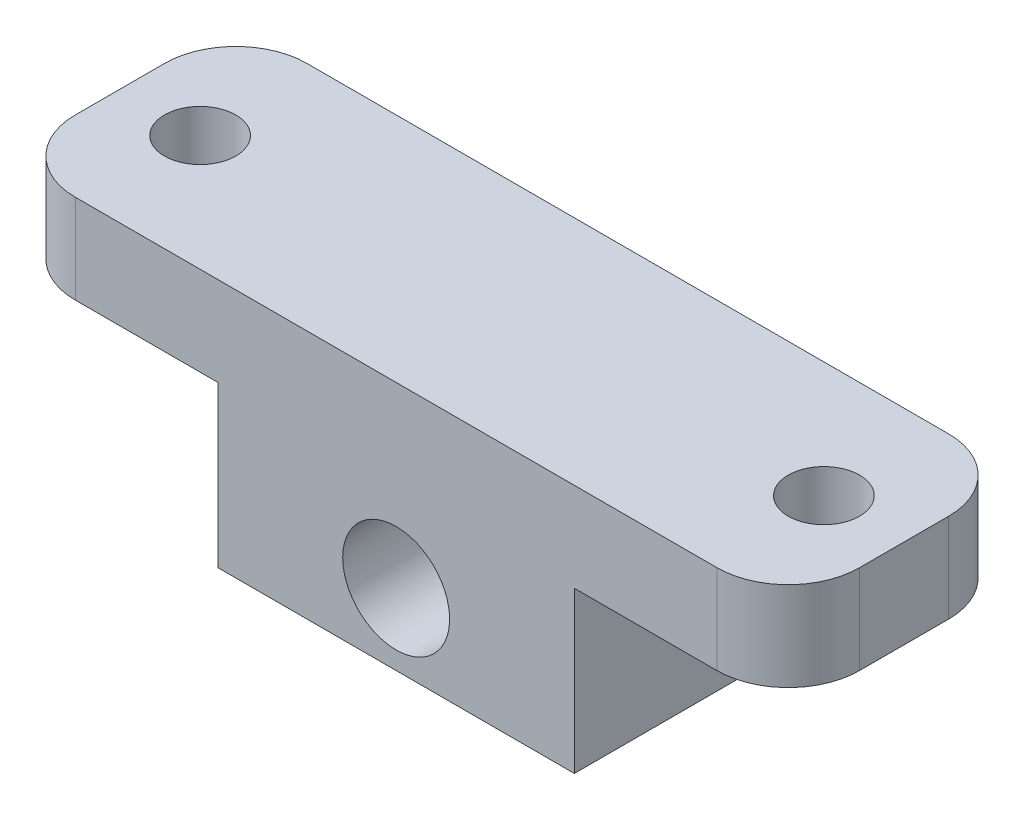
ISO-10303-21;
HEADER;
FILE_DESCRIPTION(('STEP AP214'),'2;1');
FILE_NAME('part.step','',(''),(''),'','','');
FILE_SCHEMA(('AUTOMOTIVE_DESIGN { 1 0 10303 214 1 1 1 1 }'));
ENDSEC;
DATA;
#1=APPLICATION_CONTEXT('core data for automotive mechanical design processes');
#2=APPLICATION_PROTOCOL_DEFINITION('international standard','automotive_design',2000,#1);
#3=PRODUCT_CONTEXT('',#1,'mechanical');
#4=PRODUCT('Part','Part','',(#3));
#5=PRODUCT_RELATED_PRODUCT_CATEGORY('part','',(#4));
#6=PRODUCT_DEFINITION_FORMATION('','',#4);
#7=PRODUCT_DEFINITION_CONTEXT('part definition',#1,'design');
#8=PRODUCT_DEFINITION('design','',#6,#7);
#9=PRODUCT_DEFINITION_SHAPE('','',#8);
#10=(LENGTH_UNIT() NAMED_UNIT(*) SI_UNIT(.MILLI.,.METRE.));
#11=(NAMED_UNIT(*) PLANE_ANGLE_UNIT() SI_UNIT($,.RADIAN.));
#12=(NAMED_UNIT(*) SI_UNIT($,.STERADIAN.) SOLID_ANGLE_UNIT());
#13=UNCERTAINTY_MEASURE_WITH_UNIT(LENGTH_MEASURE(1.E-05),#10,'distance_accuracy_value','');
#14=(GEOMETRIC_REPRESENTATION_CONTEXT(3) GLOBAL_UNCERTAINTY_ASSIGNED_CONTEXT((#13)) GLOBAL_UNIT_ASSIGNED_CONTEXT((#10,
#11,#12)) REPRESENTATION_CONTEXT('',''));
#15=CARTESIAN_POINT('',(0.,0.,0.));
#16=DIRECTION('',(0.,0.,1.));
#17=DIRECTION('',(1.,0.,0.));
#18=AXIS2_PLACEMENT_3D('',#15,#16,#17);
#19=CARTESIAN_POINT('',(5.00000000000001,0.,6.5));
#20=DIRECTION('',(1.,0.,0.));
#21=DIRECTION('',(0.,0.,-1.));
#22=AXIS2_PLACEMENT_3D('',#19,#20,#21);
#23=PLANE('',#22);
#24=DIRECTION('',(0.,0.,-1.));
#25=VECTOR('',#24,1.);
#26=CARTESIAN_POINT('',(5.00000000000001,21.3633860115138,6.5));
#27=LINE('',#26,#25);
#28=CARTESIAN_POINT('',(5.00000000000001,21.3633860115138,6.5));
#29=VERTEX_POINT('',#28);
#30=CARTESIAN_POINT('',(5.,21.3633860115138,0.));
#31=VERTEX_POINT('',#30);
#32=EDGE_CURVE('E139',#29,#31,#27,.T.);
#33=ORIENTED_EDGE('',*,*,#32,.F.);
#34=DIRECTION('',(0.,-1.,0.));
#35=VECTOR('',#34,1.);
#36=CARTESIAN_POINT('',(5.00000000000001,0.,6.5));
#37=LINE('',#36,#35);
#38=CARTESIAN_POINT('',(5.,16.8633860115138,6.5));
#39=VERTEX_POINT('',#38);
#40=EDGE_CURVE('E152',#29,#39,#37,.T.);
#41=ORIENTED_EDGE('',*,*,#40,.T.);
#42=DIRECTION('',(0.,0.,-1.));
#43=VECTOR('',#42,1.);
#44=CARTESIAN_POINT('',(5.,16.8633860115138,6.5));
#45=LINE('',#44,#43);
#46=CARTESIAN_POINT('',(5.,16.8633860115138,0.));
#47=VERTEX_POINT('',#46);
#48=EDGE_CURVE('E186',#39,#47,#45,.T.);
#49=ORIENTED_EDGE('',*,*,#48,.T.);
#50=DIRECTION('',(0.,-1.,0.));
#51=VECTOR('',#50,1.);
#52=CARTESIAN_POINT('',(5.00000000000001,0.,0.));
#53=LINE('',#52,#51);
#54=EDGE_CURVE('E154',#31,#47,#53,.T.);
#55=ORIENTED_EDGE('',*,*,#54,.F.);
#56=EDGE_LOOP('',(#33,#41,#49,#55));
#57=FACE_BOUND('',#56,.T.);
#58=ADVANCED_FACE('F47',(#57),#23,.T.);
#59=CARTESIAN_POINT('',(0.,23.8633860115138,6.5));
#60=DIRECTION('',(0.,1.,0.));
#61=DIRECTION('',(0.,0.,1.));
#62=AXIS2_PLACEMENT_3D('',#59,#60,#61);
#63=PLANE('',#62);
#64=DIRECTION('',(1.,0.,0.));
#65=VECTOR('',#64,1.);
#66=CARTESIAN_POINT('',(0.,23.8633860115138,0.));
#67=LINE('',#66,#65);
#68=CARTESIAN_POINT('',(-9.,23.8633860115138,0.));
#69=VERTEX_POINT('',#68);
#70=CARTESIAN_POINT('',(9.,23.8633860115138,0.));
#71=VERTEX_POINT('',#70);
#72=EDGE_CURVE('E189',#69,#71,#67,.T.);
#73=ORIENTED_EDGE('',*,*,#72,.F.);
#74=CARTESIAN_POINT('',(-9.,23.8633860115138,2.));
#75=DIRECTION('',(0.,1.,0.));
#76=DIRECTION('',(0.,0.,1.));
#77=AXIS2_PLACEMENT_3D('',#74,#75,#76);
#78=CIRCLE('',#77,2.);
#79=CARTESIAN_POINT('',(-11.,23.8633860115138,2.));
#80=VERTEX_POINT('',#79);
#81=EDGE_CURVE('E221',#69,#80,#78,.T.);
#82=ORIENTED_EDGE('',*,*,#81,.T.);
#83=DIRECTION('',(0.,0.,1.));
#84=VECTOR('',#83,1.);
#85=CARTESIAN_POINT('',(-11.,23.8633860115138,6.5));
#86=LINE('',#85,#84);
#87=CARTESIAN_POINT('',(-11.,23.8633860115138,4.5));
#88=VERTEX_POINT('',#87);
#89=EDGE_CURVE('E260',#80,#88,#86,.T.);
#90=ORIENTED_EDGE('',*,*,#89,.T.);
#91=CARTESIAN_POINT('',(-9.,23.8633860115138,4.5));
#92=DIRECTION('',(0.,1.,0.));
#93=DIRECTION('',(0.,0.,1.));
#94=AXIS2_PLACEMENT_3D('',#91,#92,#93);
#95=CIRCLE('',#94,2.);
#96=CARTESIAN_POINT('',(-9.,23.8633860115138,6.5));
#97=VERTEX_POINT('',#96);
#98=EDGE_CURVE('E218',#88,#97,#95,.T.);
#99=ORIENTED_EDGE('',*,*,#98,.T.);
#100=DIRECTION('',(1.,0.,0.));
#101=VECTOR('',#100,1.);
#102=CARTESIAN_POINT('',(0.,23.8633860115138,6.5));
#103=LINE('',#102,#101);
#104=CARTESIAN_POINT('',(9.,23.8633860115138,6.5));
#105=VERTEX_POINT('',#104);
#106=EDGE_CURVE('E165',#97,#105,#103,.T.);
#107=ORIENTED_EDGE('',*,*,#106,.T.);
#108=CARTESIAN_POINT('',(9.,23.8633860115138,4.5));
#109=DIRECTION('',(0.,1.,0.));
#110=DIRECTION('',(0.,0.,1.));
#111=AXIS2_PLACEMENT_3D('',#108,#109,#110);
#112=CIRCLE('',#111,2.);
#113=CARTESIAN_POINT('',(11.,23.8633860115138,4.5));
#114=VERTEX_POINT('',#113);
#115=EDGE_CURVE('E215',#105,#114,#112,.T.);
#116=ORIENTED_EDGE('',*,*,#115,.T.);
#117=DIRECTION('',(0.,0.,-1.));
#118=VECTOR('',#117,1.);
#119=CARTESIAN_POINT('',(11.,23.8633860115138,6.5));
#120=LINE('',#119,#118);
#121=CARTESIAN_POINT('',(11.,23.8633860115138,2.));
#122=VERTEX_POINT('',#121);
#123=EDGE_CURVE('E252',#114,#122,#120,.T.);
#124=ORIENTED_EDGE('',*,*,#123,.T.);
#125=CARTESIAN_POINT('',(9.,23.8633860115138,2.));
#126=DIRECTION('',(0.,1.,0.));
#127=DIRECTION('',(0.,0.,1.));
#128=AXIS2_PLACEMENT_3D('',#125,#126,#127);
#129=CIRCLE('',#128,2.);
#130=EDGE_CURVE('E212',#122,#71,#129,.T.);
#131=ORIENTED_EDGE('',*,*,#130,.T.);
#132=EDGE_LOOP('',(#73,#82,#90,#99,#107,#116,#124,#131));
#133=FACE_BOUND('',#132,.T.);
#134=CARTESIAN_POINT('',(-8.75,23.8633860115138,3.25));
#135=DIRECTION('',(0.,1.,0.));
#136=DIRECTION('',(0.,0.,1.));
#137=AXIS2_PLACEMENT_3D('',#134,#135,#136);
#138=CIRCLE('',#137,1.);
#139=CARTESIAN_POINT('',(-8.75,23.8633860115138,4.25));
#140=VERTEX_POINT('',#139);
#141=EDGE_CURVE('E268',#140,#140,#138,.T.);
#142=ORIENTED_EDGE('',*,*,#141,.F.);
#143=EDGE_LOOP('',(#142));
#144=FACE_BOUND('',#143,.T.);
#145=CARTESIAN_POINT('',(8.75,23.8633860115138,3.25));
#146=DIRECTION('',(0.,1.,0.));
#147=DIRECTION('',(0.,0.,-1.));
#148=AXIS2_PLACEMENT_3D('',#145,#146,#147);
#149=CIRCLE('',#148,1.);
#150=CARTESIAN_POINT('',(8.75,23.8633860115138,2.25));
#151=VERTEX_POINT('',#150);
#152=EDGE_CURVE('E374',#151,#151,#149,.T.);
#153=ORIENTED_EDGE('',*,*,#152,.F.);
#154=EDGE_LOOP('',(#153));
#155=FACE_BOUND('',#154,.T.);
#156=ADVANCED_FACE('F257',(#133,#144,#155),#63,.T.);
#157=CARTESIAN_POINT('',(-4.99999999999999,0.,6.5));
#158=DIRECTION('',(1.,0.,0.));
#159=DIRECTION('',(0.,0.,-1.));
#160=AXIS2_PLACEMENT_3D('',#157,#158,#159);
#161=PLANE('',#160);
#162=DIRECTION('',(0.,-1.,0.));
#163=VECTOR('',#162,1.);
#164=CARTESIAN_POINT('',(-4.99999999999999,0.,6.5));
#165=LINE('',#164,#163);
#166=CARTESIAN_POINT('',(-4.99999999999999,21.3633860115138,6.5));
#167=VERTEX_POINT('',#166);
#168=CARTESIAN_POINT('',(-5.,16.8633860115138,6.5));
#169=VERTEX_POINT('',#168);
#170=EDGE_CURVE('E171',#167,#169,#165,.T.);
#171=ORIENTED_EDGE('',*,*,#170,.F.);
#172=DIRECTION('',(0.,0.,-1.));
#173=VECTOR('',#172,1.);
#174=CARTESIAN_POINT('',(-4.99999999999999,21.3633860115138,6.5));
#175=LINE('',#174,#173);
#176=CARTESIAN_POINT('',(-4.99999999999999,21.3633860115138,0.));
#177=VERTEX_POINT('',#176);
#178=EDGE_CURVE('E156',#167,#177,#175,.T.);
#179=ORIENTED_EDGE('',*,*,#178,.T.);
#180=DIRECTION('',(0.,-1.,0.));
#181=VECTOR('',#180,1.);
#182=CARTESIAN_POINT('',(-4.99999999999999,0.,0.));
#183=LINE('',#182,#181);
#184=CARTESIAN_POINT('',(-5.,16.8633860115138,0.));
#185=VERTEX_POINT('',#184);
#186=EDGE_CURVE('E193',#177,#185,#183,.T.);
#187=ORIENTED_EDGE('',*,*,#186,.T.);
#188=DIRECTION('',(0.,0.,-1.));
#189=VECTOR('',#188,1.);
#190=CARTESIAN_POINT('',(-5.,16.8633860115138,6.5));
#191=LINE('',#190,#189);
#192=EDGE_CURVE('E201',#169,#185,#191,.T.);
#193=ORIENTED_EDGE('',*,*,#192,.F.);
#194=EDGE_LOOP('',(#171,#179,#187,#193));
#195=FACE_BOUND('',#194,.T.);
#196=ADVANCED_FACE('F282',(#195),#161,.F.);
#197=CARTESIAN_POINT('',(0.,16.8633860115138,6.5));
#198=DIRECTION('',(0.,1.,0.));
#199=DIRECTION('',(0.,0.,1.));
#200=AXIS2_PLACEMENT_3D('',#197,#198,#199);
#201=PLANE('',#200);
#202=DIRECTION('',(1.,0.,0.));
#203=VECTOR('',#202,1.);
#204=CARTESIAN_POINT('',(0.,16.8633860115138,0.));
#205=LINE('',#204,#203);
#206=EDGE_CURVE('E174',#185,#47,#205,.T.);
#207=ORIENTED_EDGE('',*,*,#206,.T.);
#208=ORIENTED_EDGE('',*,*,#48,.F.);
#209=DIRECTION('',(1.,0.,0.));
#210=VECTOR('',#209,1.);
#211=CARTESIAN_POINT('',(0.,16.8633860115138,6.5));
#212=LINE('',#211,#210);
#213=EDGE_CURVE('E162',#169,#39,#212,.T.);
#214=ORIENTED_EDGE('',*,*,#213,.F.);
#215=ORIENTED_EDGE('',*,*,#192,.T.);
#216=EDGE_LOOP('',(#207,#208,#214,#215));
#217=FACE_BOUND('',#216,.T.);
#218=ADVANCED_FACE('F340',(#217),#201,.F.);
#219=CARTESIAN_POINT('',(0.,18.8633860115138,6.5));
#220=DIRECTION('',(0.,0.,-1.));
#221=DIRECTION('',(-1.,0.,0.));
#222=AXIS2_PLACEMENT_3D('',#219,#220,#221);
#223=CYLINDRICAL_SURFACE('',#222,1.5);
#224=CARTESIAN_POINT('',(0.,18.8633860115138,6.5));
#225=DIRECTION('',(0.,0.,1.));
#226=DIRECTION('',(1.,0.,0.));
#227=AXIS2_PLACEMENT_3D('',#224,#225,#226);
#228=CIRCLE('',#227,1.5);
#229=CARTESIAN_POINT('',(-1.5,18.8633860115138,6.5));
#230=VERTEX_POINT('',#229);
#231=EDGE_CURVE('E182',#230,#230,#228,.T.);
#232=CARTESIAN_POINT('',(0.,18.8633860115138,0.));
#233=DIRECTION('',(0.,0.,1.));
#234=DIRECTION('',(1.,0.,0.));
#235=AXIS2_PLACEMENT_3D('',#232,#233,#234);
#236=CIRCLE('',#235,1.5);
#237=CARTESIAN_POINT('',(-1.5,18.8633860115138,0.));
#238=VERTEX_POINT('',#237);
#239=EDGE_CURVE('E166',#238,#238,#236,.T.);
#240=CARTESIAN_POINT('',(-1.5,18.8633860115138,6.5));
#241=CARTESIAN_POINT('',(-1.5,18.8633860115138,6.43229166666667));
#242=CARTESIAN_POINT('',(-1.5,18.8633860115138,6.36458333333333));
#243=CARTESIAN_POINT('',(-1.5,18.8633860115138,6.22916666666667));
#244=CARTESIAN_POINT('',(-1.5,18.8633860115138,6.16145833333333));
#245=CARTESIAN_POINT('',(-1.5,18.8633860115138,6.02604166666667));
#246=CARTESIAN_POINT('',(-1.5,18.8633860115138,5.95833333333333));
#247=CARTESIAN_POINT('',(-1.5,18.8633860115138,5.82291666666667));
#248=CARTESIAN_POINT('',(-1.5,18.8633860115138,5.75520833333333));
#249=CARTESIAN_POINT('',(-1.5,18.8633860115138,5.61979166666667));
#250=CARTESIAN_POINT('',(-1.5,18.8633860115138,5.55208333333333));
#251=CARTESIAN_POINT('',(-1.5,18.8633860115138,5.41666666666667));
#252=CARTESIAN_POINT('',(-1.5,18.8633860115138,5.34895833333333));
#253=CARTESIAN_POINT('',(-1.5,18.8633860115138,5.21354166666667));
#254=CARTESIAN_POINT('',(-1.5,18.8633860115138,5.14583333333333));
#255=CARTESIAN_POINT('',(-1.5,18.8633860115138,5.01041666666667));
#256=CARTESIAN_POINT('',(-1.5,18.8633860115138,4.94270833333333));
#257=CARTESIAN_POINT('',(-1.5,18.8633860115138,4.80729166666667));
#258=CARTESIAN_POINT('',(-1.5,18.8633860115138,4.73958333333333));
#259=CARTESIAN_POINT('',(-1.5,18.8633860115138,4.60416666666667));
#260=CARTESIAN_POINT('',(-1.5,18.8633860115138,4.53645833333333));
#261=CARTESIAN_POINT('',(-1.5,18.8633860115138,4.40104166666667));
#262=CARTESIAN_POINT('',(-1.5,18.8633860115138,4.33333333333333));
#263=CARTESIAN_POINT('',(-1.5,18.8633860115138,4.19791666666667));
#264=CARTESIAN_POINT('',(-1.5,18.8633860115138,4.13020833333333));
#265=CARTESIAN_POINT('',(-1.5,18.8633860115138,3.99479166666667));
#266=CARTESIAN_POINT('',(-1.5,18.8633860115138,3.92708333333333));
#267=CARTESIAN_POINT('',(-1.5,18.8633860115138,3.79166666666667));
#268=CARTESIAN_POINT('',(-1.5,18.8633860115138,3.72395833333333));
#269=CARTESIAN_POINT('',(-1.5,18.8633860115138,3.58854166666667));
#270=CARTESIAN_POINT('',(-1.5,18.8633860115138,3.52083333333333));
#271=CARTESIAN_POINT('',(-1.5,18.8633860115138,3.38541666666667));
#272=CARTESIAN_POINT('',(-1.5,18.8633860115138,3.31770833333333));
#273=CARTESIAN_POINT('',(-1.5,18.8633860115138,3.18229166666667));
#274=CARTESIAN_POINT('',(-1.5,18.8633860115138,3.11458333333333));
#275=CARTESIAN_POINT('',(-1.5,18.8633860115138,2.97916666666667));
#276=CARTESIAN_POINT('',(-1.5,18.8633860115138,2.91145833333333));
#277=CARTESIAN_POINT('',(-1.5,18.8633860115138,2.77604166666667));
#278=CARTESIAN_POINT('',(-1.5,18.8633860115138,2.70833333333333));
#279=CARTESIAN_POINT('',(-1.5,18.8633860115138,2.57291666666667));
#280=CARTESIAN_POINT('',(-1.5,18.8633860115138,2.50520833333333));
#281=CARTESIAN_POINT('',(-1.5,18.8633860115138,2.36979166666667));
#282=CARTESIAN_POINT('',(-1.5,18.8633860115138,2.30208333333333));
#283=CARTESIAN_POINT('',(-1.5,18.8633860115138,2.16666666666667));
#284=CARTESIAN_POINT('',(-1.5,18.8633860115138,2.09895833333333));
#285=CARTESIAN_POINT('',(-1.5,18.8633860115138,1.96354166666667));
#286=CARTESIAN_POINT('',(-1.5,18.8633860115138,1.89583333333333));
#287=CARTESIAN_POINT('',(-1.5,18.8633860115138,1.76041666666667));
#288=CARTESIAN_POINT('',(-1.5,18.8633860115138,1.69270833333333));
#289=CARTESIAN_POINT('',(-1.5,18.8633860115138,1.55729166666667));
#290=CARTESIAN_POINT('',(-1.5,18.8633860115138,1.48958333333333));
#291=CARTESIAN_POINT('',(-1.5,18.8633860115138,1.35416666666667));
#292=CARTESIAN_POINT('',(-1.5,18.8633860115138,1.28645833333333));
#293=CARTESIAN_POINT('',(-1.5,18.8633860115138,1.15104166666667));
#294=CARTESIAN_POINT('',(-1.5,18.8633860115138,1.08333333333333));
#295=CARTESIAN_POINT('',(-1.5,18.8633860115138,0.947916666666667));
#296=CARTESIAN_POINT('',(-1.5,18.8633860115138,0.880208333333333));
#297=CARTESIAN_POINT('',(-1.5,18.8633860115138,0.744791666666667));
#298=CARTESIAN_POINT('',(-1.5,18.8633860115138,0.677083333333333));
#299=CARTESIAN_POINT('',(-1.5,18.8633860115138,0.541666666666667));
#300=CARTESIAN_POINT('',(-1.5,18.8633860115138,0.473958333333333));
#301=CARTESIAN_POINT('',(-1.5,18.8633860115138,0.338541666666667));
#302=CARTESIAN_POINT('',(-1.5,18.8633860115138,0.270833333333334));
#303=CARTESIAN_POINT('',(-1.5,18.8633860115138,0.135416666666667));
#304=CARTESIAN_POINT('',(-1.5,18.8633860115138,0.0677083333333334));
#305=CARTESIAN_POINT('',(-1.5,18.8633860115138,0.));
#306=B_SPLINE_CURVE_WITH_KNOTS('',3,(#240,#241,#242,#243,#244,#245,#246,#247,#248,#249,#250,
#251,#252,#253,#254,#255,#256,#257,#258,#259,#260,#261,#262,#263,#264,#265,#266,#267,#268,#269,
#270,#271,#272,#273,#274,#275,#276,#277,#278,#279,#280,#281,#282,#283,#284,#285,#286,#287,#288,
#289,#290,#291,#292,#293,#294,#295,#296,#297,#298,#299,#300,#301,#302,#303,#304,#305),
.UNSPECIFIED.,.F.,.F.,(4,2,2,2,2,2,2,2,2,2,2,2,2,2,2,2,2,2,2,2,2,2,2,2,2,2,2,2,2,2,2,2,4),(0.,
0.203124999999999,0.40625,0.609375,0.812499999999999,1.015625,1.21875,1.421875,1.625,1.828125,
2.03125,2.234375,2.4375,2.640625,2.84375,3.046875,3.25,3.453125,3.65625,3.859375,4.0625,
4.265625,4.46875,4.671875,4.875,5.078125,5.28125,5.484375,5.6875,5.890625,6.09375,6.296875,6.5),.UNSPECIFIED.);
#307=EDGE_CURVE('BSEAM342',#230,#238,#306,.T.);
#308=ORIENTED_EDGE('',*,*,#231,.T.);
#309=ORIENTED_EDGE('',*,*,#239,.F.);
#310=ORIENTED_EDGE('',*,*,#307,.T.);
#311=ORIENTED_EDGE('',*,*,#307,.F.);
#312=EDGE_LOOP('',(#308,#310,#309,#311));
#313=FACE_BOUND('',#312,.T.);
#314=ADVANCED_FACE('F342',(#313),#223,.F.);
#315=CARTESIAN_POINT('',(0.,0.,6.5));
#316=DIRECTION('',(0.,0.,1.));
#317=DIRECTION('',(1.,0.,0.));
#318=AXIS2_PLACEMENT_3D('',#315,#316,#317);
#319=PLANE('',#318);
#320=ORIENTED_EDGE('',*,*,#106,.F.);
#321=DIRECTION('',(0.,1.,0.));
#322=VECTOR('',#321,1.);
#323=CARTESIAN_POINT('',(-9.,0.,6.5));
#324=LINE('',#323,#322);
#325=CARTESIAN_POINT('',(-9.,21.3633860115138,6.5));
#326=VERTEX_POINT('',#325);
#327=EDGE_CURVE('E240',#97,#326,#324,.F.);
#328=ORIENTED_EDGE('',*,*,#327,.T.);
#329=DIRECTION('',(1.,0.,0.));
#330=VECTOR('',#329,1.);
#331=CARTESIAN_POINT('',(-11.,21.3633860115138,6.5));
#332=LINE('',#331,#330);
#333=EDGE_CURVE('E147',#326,#167,#332,.T.);
#334=ORIENTED_EDGE('',*,*,#333,.T.);
#335=ORIENTED_EDGE('',*,*,#170,.T.);
#336=ORIENTED_EDGE('',*,*,#213,.T.);
#337=ORIENTED_EDGE('',*,*,#40,.F.);
#338=CARTESIAN_POINT('',(9.,21.3633860115138,6.5));
#339=VERTEX_POINT('',#338);
#340=EDGE_CURVE('E136',#29,#339,#332,.T.);
#341=ORIENTED_EDGE('',*,*,#340,.T.);
#342=DIRECTION('',(0.,1.,0.));
#343=VECTOR('',#342,1.);
#344=CARTESIAN_POINT('',(9.,0.,6.5));
#345=LINE('',#344,#343);
#346=EDGE_CURVE('E237',#339,#105,#345,.T.);
#347=ORIENTED_EDGE('',*,*,#346,.T.);
#348=EDGE_LOOP('',(#320,#328,#334,#335,#336,#337,#341,#347));
#349=FACE_BOUND('',#348,.T.);
#350=ORIENTED_EDGE('',*,*,#231,.F.);
#351=EDGE_LOOP('',(#350));
#352=FACE_BOUND('',#351,.T.);
#353=ADVANCED_FACE('F159',(#349,#352),#319,.T.);
#354=CARTESIAN_POINT('',(0.,0.,0.));
#355=DIRECTION('',(0.,0.,1.));
#356=DIRECTION('',(1.,0.,0.));
#357=AXIS2_PLACEMENT_3D('',#354,#355,#356);
#358=PLANE('',#357);
#359=DIRECTION('',(-1.,0.,0.));
#360=VECTOR('',#359,1.);
#361=CARTESIAN_POINT('',(-11.,21.3633860115138,0.));
#362=LINE('',#361,#360);
#363=CARTESIAN_POINT('',(-9.,21.3633860115138,0.));
#364=VERTEX_POINT('',#363);
#365=EDGE_CURVE('E287',#177,#364,#362,.T.);
#366=ORIENTED_EDGE('',*,*,#365,.T.);
#367=DIRECTION('',(0.,1.,0.));
#368=VECTOR('',#367,1.);
#369=CARTESIAN_POINT('',(-9.,23.8633860115138,0.));
#370=LINE('',#369,#368);
#371=EDGE_CURVE('E208',#364,#69,#370,.T.);
#372=ORIENTED_EDGE('',*,*,#371,.T.);
#373=ORIENTED_EDGE('',*,*,#72,.T.);
#374=DIRECTION('',(0.,1.,0.));
#375=VECTOR('',#374,1.);
#376=CARTESIAN_POINT('',(9.,21.3633860115138,0.));
#377=LINE('',#376,#375);
#378=CARTESIAN_POINT('',(8.99999999999999,21.3633860115138,0.));
#379=VERTEX_POINT('',#378);
#380=EDGE_CURVE('E205',#71,#379,#377,.F.);
#381=ORIENTED_EDGE('',*,*,#380,.T.);
#382=EDGE_CURVE('E292',#379,#31,#362,.T.);
#383=ORIENTED_EDGE('',*,*,#382,.T.);
#384=ORIENTED_EDGE('',*,*,#54,.T.);
#385=ORIENTED_EDGE('',*,*,#206,.F.);
#386=ORIENTED_EDGE('',*,*,#186,.F.);
#387=EDGE_LOOP('',(#366,#372,#373,#381,#383,#384,#385,#386));
#388=FACE_BOUND('',#387,.T.);
#389=ORIENTED_EDGE('',*,*,#239,.T.);
#390=EDGE_LOOP('',(#389));
#391=FACE_BOUND('',#390,.T.);
#392=ADVANCED_FACE('F335',(#388,#391),#358,.F.);
#393=CARTESIAN_POINT('',(-11.,21.3633860115138,6.5));
#394=DIRECTION('',(-1.,0.,0.));
#395=DIRECTION('',(0.,0.,1.));
#396=AXIS2_PLACEMENT_3D('',#393,#394,#395);
#397=PLANE('',#396);
#398=ORIENTED_EDGE('',*,*,#89,.F.);
#399=DIRECTION('',(0.,1.,0.));
#400=VECTOR('',#399,1.);
#401=CARTESIAN_POINT('',(-11.,21.3633860115138,2.));
#402=LINE('',#401,#400);
#403=CARTESIAN_POINT('',(-11.,21.3633860115138,2.));
#404=VERTEX_POINT('',#403);
#405=EDGE_CURVE('E228',#80,#404,#402,.F.);
#406=ORIENTED_EDGE('',*,*,#405,.T.);
#407=DIRECTION('',(0.,0.,1.));
#408=VECTOR('',#407,1.);
#409=CARTESIAN_POINT('',(-11.,21.3633860115138,6.5));
#410=LINE('',#409,#408);
#411=CARTESIAN_POINT('',(-11.,21.3633860115138,4.5));
#412=VERTEX_POINT('',#411);
#413=EDGE_CURVE('E148',#404,#412,#410,.T.);
#414=ORIENTED_EDGE('',*,*,#413,.T.);
#415=DIRECTION('',(0.,1.,0.));
#416=VECTOR('',#415,1.);
#417=CARTESIAN_POINT('',(-11.,21.3633860115138,4.5));
#418=LINE('',#417,#416);
#419=EDGE_CURVE('E224',#412,#88,#418,.T.);
#420=ORIENTED_EDGE('',*,*,#419,.T.);
#421=EDGE_LOOP('',(#398,#406,#414,#420));
#422=FACE_BOUND('',#421,.T.);
#423=ADVANCED_FACE('F303',(#422),#397,.T.);
#424=CARTESIAN_POINT('',(-8.75,21.3633860115138,3.25));
#425=DIRECTION('',(0.,1.,0.));
#426=DIRECTION('',(0.,0.,1.));
#427=AXIS2_PLACEMENT_3D('',#424,#425,#426);
#428=CYLINDRICAL_SURFACE('',#427,1.);
#429=CARTESIAN_POINT('',(-8.75,21.3633860115138,3.25));
#430=DIRECTION('',(0.,1.,0.));
#431=DIRECTION('',(0.,0.,1.));
#432=AXIS2_PLACEMENT_3D('',#429,#430,#431);
#433=CIRCLE('',#432,1.);
#434=CARTESIAN_POINT('',(-8.75,21.3633860115138,4.25));
#435=VERTEX_POINT('',#434);
#436=EDGE_CURVE('E261',#435,#435,#433,.T.);
#437=ORIENTED_EDGE('',*,*,#436,.F.);
#438=EDGE_LOOP('',(#437));
#439=FACE_BOUND('',#438,.T.);
#440=ORIENTED_EDGE('',*,*,#141,.T.);
#441=EDGE_LOOP('',(#440));
#442=FACE_BOUND('',#441,.T.);
#443=ADVANCED_FACE('F357',(#439,#442),#428,.F.);
#444=CARTESIAN_POINT('',(0.,21.3633860115138,0.));
#445=DIRECTION('',(0.,-1.,0.));
#446=DIRECTION('',(0.,0.,-1.));
#447=AXIS2_PLACEMENT_3D('',#444,#445,#446);
#448=PLANE('',#447);
#449=ORIENTED_EDGE('',*,*,#436,.T.);
#450=EDGE_LOOP('',(#449));
#451=FACE_BOUND('',#450,.T.);
#452=ORIENTED_EDGE('',*,*,#413,.F.);
#453=CARTESIAN_POINT('',(-9.,21.3633860115138,2.));
#454=DIRECTION('',(0.,-1.,0.));
#455=DIRECTION('',(0.,0.,-1.));
#456=AXIS2_PLACEMENT_3D('',#453,#454,#455);
#457=CIRCLE('',#456,2.);
#458=EDGE_CURVE('E234',#404,#364,#457,.T.);
#459=ORIENTED_EDGE('',*,*,#458,.T.);
#460=ORIENTED_EDGE('',*,*,#365,.F.);
#461=ORIENTED_EDGE('',*,*,#178,.F.);
#462=ORIENTED_EDGE('',*,*,#333,.F.);
#463=CARTESIAN_POINT('',(-9.,21.3633860115138,4.5));
#464=DIRECTION('',(0.,-1.,0.));
#465=DIRECTION('',(0.,0.,-1.));
#466=AXIS2_PLACEMENT_3D('',#463,#464,#465);
#467=CIRCLE('',#466,2.);
#468=EDGE_CURVE('E231',#326,#412,#467,.T.);
#469=ORIENTED_EDGE('',*,*,#468,.T.);
#470=EDGE_LOOP('',(#452,#459,#460,#461,#462,#469));
#471=FACE_BOUND('',#470,.T.);
#472=ADVANCED_FACE('F285',(#451,#471),#448,.T.);
#473=CARTESIAN_POINT('',(11.,21.3633860115138,6.5));
#474=DIRECTION('',(1.,0.,0.));
#475=DIRECTION('',(0.,0.,-1.));
#476=AXIS2_PLACEMENT_3D('',#473,#474,#475);
#477=PLANE('',#476);
#478=ORIENTED_EDGE('',*,*,#123,.F.);
#479=DIRECTION('',(0.,1.,0.));
#480=VECTOR('',#479,1.);
#481=CARTESIAN_POINT('',(11.,21.3633860115138,4.5));
#482=LINE('',#481,#480);
#483=CARTESIAN_POINT('',(11.,21.3633860115138,4.5));
#484=VERTEX_POINT('',#483);
#485=EDGE_CURVE('E69',#114,#484,#482,.F.);
#486=ORIENTED_EDGE('',*,*,#485,.T.);
#487=DIRECTION('',(0.,0.,-1.));
#488=VECTOR('',#487,1.);
#489=CARTESIAN_POINT('',(11.,21.3633860115138,6.5));
#490=LINE('',#489,#488);
#491=CARTESIAN_POINT('',(11.,21.3633860115138,2.));
#492=VERTEX_POINT('',#491);
#493=EDGE_CURVE('E253',#484,#492,#490,.T.);
#494=ORIENTED_EDGE('',*,*,#493,.T.);
#495=DIRECTION('',(0.,1.,0.));
#496=VECTOR('',#495,1.);
#497=CARTESIAN_POINT('',(11.,23.8633860115138,2.));
#498=LINE('',#497,#496);
#499=EDGE_CURVE('E243',#492,#122,#498,.T.);
#500=ORIENTED_EDGE('',*,*,#499,.T.);
#501=EDGE_LOOP('',(#478,#486,#494,#500));
#502=FACE_BOUND('',#501,.T.);
#503=ADVANCED_FACE('F251',(#502),#477,.T.);
#504=CARTESIAN_POINT('',(8.75,21.3633860115138,3.25));
#505=DIRECTION('',(0.,1.,0.));
#506=DIRECTION('',(0.,0.,-1.));
#507=AXIS2_PLACEMENT_3D('',#504,#505,#506);
#508=CIRCLE('',#507,1.);
#509=CARTESIAN_POINT('',(8.75,21.3633860115138,2.25));
#510=VERTEX_POINT('',#509);
#511=EDGE_CURVE('E371',#510,#510,#508,.T.);
#512=ORIENTED_EDGE('',*,*,#511,.T.);
#513=EDGE_LOOP('',(#512));
#514=FACE_BOUND('',#513,.T.);
#515=ORIENTED_EDGE('',*,*,#493,.F.);
#516=CARTESIAN_POINT('',(9.,21.3633860115138,4.5));
#517=DIRECTION('',(0.,-1.,0.));
#518=DIRECTION('',(0.,0.,-1.));
#519=AXIS2_PLACEMENT_3D('',#516,#517,#518);
#520=CIRCLE('',#519,2.);
#521=EDGE_CURVE('E11',#484,#339,#520,.T.);
#522=ORIENTED_EDGE('',*,*,#521,.T.);
#523=ORIENTED_EDGE('',*,*,#340,.F.);
#524=ORIENTED_EDGE('',*,*,#32,.T.);
#525=ORIENTED_EDGE('',*,*,#382,.F.);
#526=CARTESIAN_POINT('',(9.,21.3633860115138,2.));
#527=DIRECTION('',(0.,-1.,0.));
#528=DIRECTION('',(0.,0.,-1.));
#529=AXIS2_PLACEMENT_3D('',#526,#527,#528);
#530=CIRCLE('',#529,2.);
#531=EDGE_CURVE('E56',#379,#492,#530,.T.);
#532=ORIENTED_EDGE('',*,*,#531,.T.);
#533=EDGE_LOOP('',(#515,#522,#523,#524,#525,#532));
#534=FACE_BOUND('',#533,.T.);
#535=ADVANCED_FACE('F138',(#514,#534),#448,.T.);
#536=CARTESIAN_POINT('',(8.75,21.3633860115138,3.25));
#537=DIRECTION('',(0.,1.,0.));
#538=DIRECTION('',(0.,0.,1.));
#539=AXIS2_PLACEMENT_3D('',#536,#537,#538);
#540=CYLINDRICAL_SURFACE('',#539,1.);
#541=ORIENTED_EDGE('',*,*,#511,.F.);
#542=EDGE_LOOP('',(#541));
#543=FACE_BOUND('',#542,.T.);
#544=ORIENTED_EDGE('',*,*,#152,.T.);
#545=EDGE_LOOP('',(#544));
#546=FACE_BOUND('',#545,.T.);
#547=ADVANCED_FACE('F327',(#543,#546),#540,.F.);
#548=CARTESIAN_POINT('',(-9.,0.,2.));
#549=DIRECTION('',(0.,-1.,0.));
#550=DIRECTION('',(0.,0.,-1.));
#551=AXIS2_PLACEMENT_3D('',#548,#549,#550);
#552=CYLINDRICAL_SURFACE('',#551,2.);
#553=ORIENTED_EDGE('',*,*,#458,.F.);
#554=ORIENTED_EDGE('',*,*,#405,.F.);
#555=ORIENTED_EDGE('',*,*,#81,.F.);
#556=ORIENTED_EDGE('',*,*,#371,.F.);
#557=EDGE_LOOP('',(#553,#554,#555,#556));
#558=FACE_BOUND('',#557,.T.);
#559=ADVANCED_FACE('F314',(#558),#552,.T.);
#560=CARTESIAN_POINT('',(-9.,21.3633860115138,4.5));
#561=DIRECTION('',(0.,1.,0.));
#562=DIRECTION('',(0.,0.,1.));
#563=AXIS2_PLACEMENT_3D('',#560,#561,#562);
#564=CYLINDRICAL_SURFACE('',#563,2.);
#565=ORIENTED_EDGE('',*,*,#468,.F.);
#566=ORIENTED_EDGE('',*,*,#327,.F.);
#567=ORIENTED_EDGE('',*,*,#98,.F.);
#568=ORIENTED_EDGE('',*,*,#419,.F.);
#569=EDGE_LOOP('',(#565,#566,#567,#568));
#570=FACE_BOUND('',#569,.T.);
#571=ADVANCED_FACE('F306',(#570),#564,.T.);
#572=CARTESIAN_POINT('',(9.,0.,4.5));
#573=DIRECTION('',(0.,1.,0.));
#574=DIRECTION('',(0.,0.,1.));
#575=AXIS2_PLACEMENT_3D('',#572,#573,#574);
#576=CYLINDRICAL_SURFACE('',#575,2.);
#577=ORIENTED_EDGE('',*,*,#521,.F.);
#578=ORIENTED_EDGE('',*,*,#485,.F.);
#579=ORIENTED_EDGE('',*,*,#115,.F.);
#580=ORIENTED_EDGE('',*,*,#346,.F.);
#581=EDGE_LOOP('',(#577,#578,#579,#580));
#582=FACE_BOUND('',#581,.T.);
#583=ADVANCED_FACE('F308',(#582),#576,.T.);
#584=CARTESIAN_POINT('',(9.,21.3633860115138,2.));
#585=DIRECTION('',(0.,-1.,0.));
#586=DIRECTION('',(0.,0.,-1.));
#587=AXIS2_PLACEMENT_3D('',#584,#585,#586);
#588=CYLINDRICAL_SURFACE('',#587,2.);
#589=ORIENTED_EDGE('',*,*,#531,.F.);
#590=ORIENTED_EDGE('',*,*,#380,.F.);
#591=ORIENTED_EDGE('',*,*,#130,.F.);
#592=ORIENTED_EDGE('',*,*,#499,.F.);
#593=EDGE_LOOP('',(#589,#590,#591,#592));
#594=FACE_BOUND('',#593,.T.);
#595=ADVANCED_FACE('F49',(#594),#588,.T.);
#596=CLOSED_SHELL('',(#58,#156,#196,#218,#314,#353,#392,#423,#443,#472,#503,#535,#547,#559,#571,
#583,#595));
#597=MANIFOLD_SOLID_BREP('B2',#596);
#598=ADVANCED_BREP_SHAPE_REPRESENTATION('',(#18,#597),#14);
#599=SHAPE_DEFINITION_REPRESENTATION(#9,#598);
ENDSEC;
END-ISO-10303-21;
